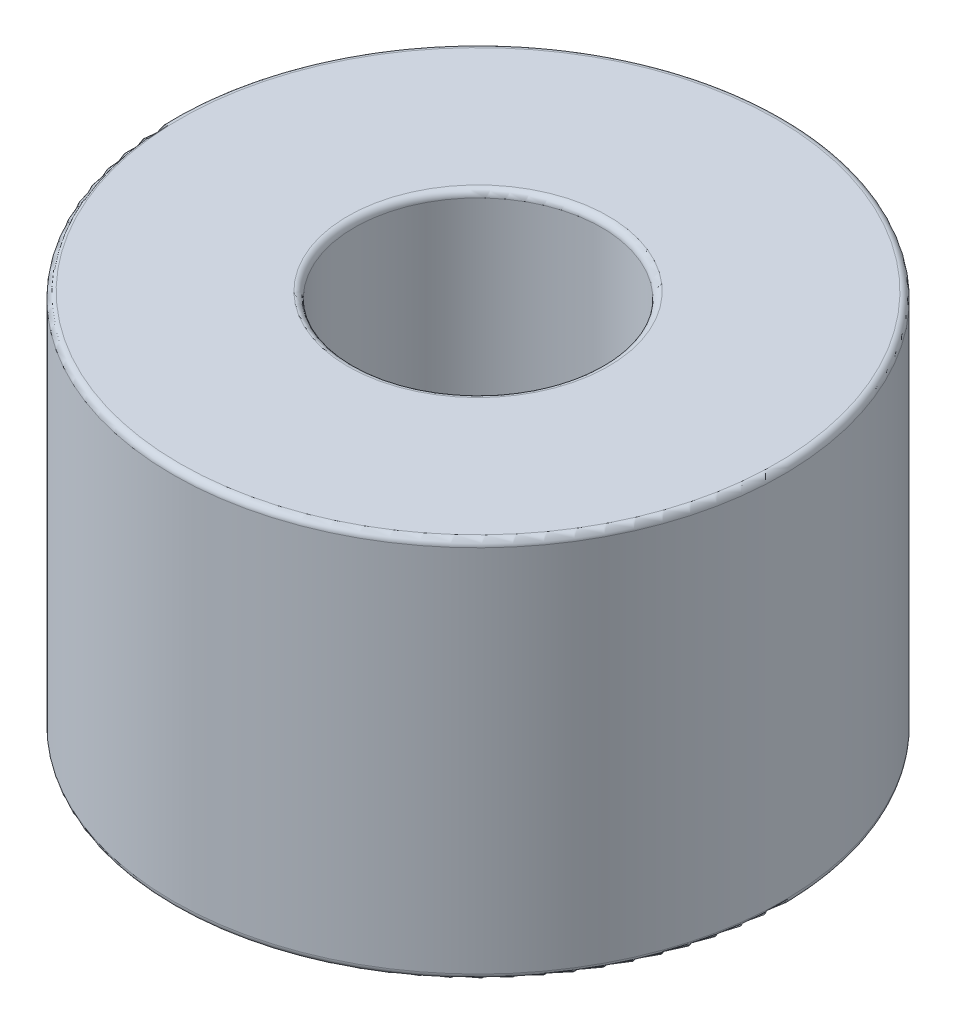
ISO-10303-21;
HEADER;
FILE_DESCRIPTION(('STEP AP214'),'2;1');
FILE_NAME('part.step','',(''),(''),'','','');
FILE_SCHEMA(('AUTOMOTIVE_DESIGN { 1 0 10303 214 1 1 1 1 }'));
ENDSEC;
DATA;
#1=APPLICATION_CONTEXT('core data for automotive mechanical design processes');
#2=APPLICATION_PROTOCOL_DEFINITION('international standard','automotive_design',2000,#1);
#3=PRODUCT_CONTEXT('',#1,'mechanical');
#4=PRODUCT('Part','Part','',(#3));
#5=PRODUCT_RELATED_PRODUCT_CATEGORY('part','',(#4));
#6=PRODUCT_DEFINITION_FORMATION('','',#4);
#7=PRODUCT_DEFINITION_CONTEXT('part definition',#1,'design');
#8=PRODUCT_DEFINITION('design','',#6,#7);
#9=PRODUCT_DEFINITION_SHAPE('','',#8);
#10=(LENGTH_UNIT() NAMED_UNIT(*) SI_UNIT(.MILLI.,.METRE.));
#11=(NAMED_UNIT(*) PLANE_ANGLE_UNIT() SI_UNIT($,.RADIAN.));
#12=(NAMED_UNIT(*) SI_UNIT($,.STERADIAN.) SOLID_ANGLE_UNIT());
#13=UNCERTAINTY_MEASURE_WITH_UNIT(LENGTH_MEASURE(1.E-05),#10,'distance_accuracy_value','');
#14=(GEOMETRIC_REPRESENTATION_CONTEXT(3) GLOBAL_UNCERTAINTY_ASSIGNED_CONTEXT((#13)) GLOBAL_UNIT_ASSIGNED_CONTEXT((#10,
#11,#12)) REPRESENTATION_CONTEXT('',''));
#15=CARTESIAN_POINT('',(0.,0.,0.));
#16=DIRECTION('',(0.,0.,1.));
#17=DIRECTION('',(1.,0.,0.));
#18=AXIS2_PLACEMENT_3D('',#15,#16,#17);
#19=CARTESIAN_POINT('',(0.,14.732,0.));
#20=DIRECTION('',(0.,1.,0.));
#21=DIRECTION('',(0.,0.,1.));
#22=AXIS2_PLACEMENT_3D('',#19,#20,#21);
#23=PLANE('',#22);
#24=CARTESIAN_POINT('',(0.,14.732,0.));
#25=DIRECTION('',(0.,1.,0.));
#26=DIRECTION('',(0.,0.,1.));
#27=AXIS2_PLACEMENT_3D('',#24,#25,#26);
#28=CIRCLE('',#27,5.019);
#29=CARTESIAN_POINT('',(0.,14.732,5.019));
#30=VERTEX_POINT('',#29);
#31=EDGE_CURVE('E52',#30,#30,#28,.F.);
#32=ORIENTED_EDGE('',*,*,#31,.T.);
#33=EDGE_LOOP('',(#32));
#34=FACE_BOUND('',#33,.T.);
#35=CARTESIAN_POINT('',(0.,14.732,0.));
#36=DIRECTION('',(0.,1.,0.));
#37=DIRECTION('',(0.,0.,1.));
#38=AXIS2_PLACEMENT_3D('',#35,#36,#37);
#39=CIRCLE('',#38,11.496);
#40=CARTESIAN_POINT('',(0.,14.732,11.496));
#41=VERTEX_POINT('',#40);
#42=EDGE_CURVE('E55',#41,#41,#39,.T.);
#43=ORIENTED_EDGE('',*,*,#42,.T.);
#44=EDGE_LOOP('',(#43));
#45=FACE_BOUND('',#44,.T.);
#46=ADVANCED_FACE('F32',(#34,#45),#23,.T.);
#47=CARTESIAN_POINT('',(0.,0.,0.));
#48=DIRECTION('',(0.,1.,0.));
#49=DIRECTION('',(0.,0.,1.));
#50=AXIS2_PLACEMENT_3D('',#47,#48,#49);
#51=PLANE('',#50);
#52=CARTESIAN_POINT('',(0.,0.,0.));
#53=DIRECTION('',(0.,1.,0.));
#54=DIRECTION('',(0.,0.,1.));
#55=AXIS2_PLACEMENT_3D('',#52,#53,#54);
#56=CIRCLE('',#55,5.019);
#57=CARTESIAN_POINT('',(0.,0.,5.019));
#58=VERTEX_POINT('',#57);
#59=EDGE_CURVE('E10',#58,#58,#56,.T.);
#60=ORIENTED_EDGE('',*,*,#59,.T.);
#61=EDGE_LOOP('',(#60));
#62=FACE_BOUND('',#61,.T.);
#63=CARTESIAN_POINT('',(0.,0.,0.));
#64=DIRECTION('',(0.,1.,0.));
#65=DIRECTION('',(0.,0.,1.));
#66=AXIS2_PLACEMENT_3D('',#63,#64,#65);
#67=CIRCLE('',#66,11.496);
#68=CARTESIAN_POINT('',(0.,0.,11.496));
#69=VERTEX_POINT('',#68);
#70=EDGE_CURVE('E39',#69,#69,#67,.F.);
#71=ORIENTED_EDGE('',*,*,#70,.T.);
#72=EDGE_LOOP('',(#71));
#73=FACE_BOUND('',#72,.T.);
#74=ADVANCED_FACE('F80',(#62,#73),#51,.F.);
#75=CARTESIAN_POINT('',(0.,14.732,0.));
#76=DIRECTION('',(0.,-1.,0.));
#77=DIRECTION('',(0.,0.,-1.));
#78=AXIS2_PLACEMENT_3D('',#75,#76,#77);
#79=CYLINDRICAL_SURFACE('',#78,11.75);
#80=CARTESIAN_POINT('',(0.,14.478,0.));
#81=DIRECTION('',(0.,1.,0.));
#82=DIRECTION('',(0.,0.,1.));
#83=AXIS2_PLACEMENT_3D('',#80,#81,#82);
#84=CIRCLE('',#83,11.75);
#85=CARTESIAN_POINT('',(0.,14.478,11.75));
#86=VERTEX_POINT('',#85);
#87=EDGE_CURVE('E43',#86,#86,#84,.F.);
#88=ORIENTED_EDGE('',*,*,#87,.T.);
#89=EDGE_LOOP('',(#88));
#90=FACE_BOUND('',#89,.T.);
#91=CARTESIAN_POINT('',(0.,0.254000000000001,0.));
#92=DIRECTION('',(0.,1.,0.));
#93=DIRECTION('',(0.,0.,1.));
#94=AXIS2_PLACEMENT_3D('',#91,#92,#93);
#95=CIRCLE('',#94,11.75);
#96=CARTESIAN_POINT('',(0.,0.254000000000001,11.75));
#97=VERTEX_POINT('',#96);
#98=EDGE_CURVE('E47',#97,#97,#95,.T.);
#99=ORIENTED_EDGE('',*,*,#98,.T.);
#100=EDGE_LOOP('',(#99));
#101=FACE_BOUND('',#100,.T.);
#102=ADVANCED_FACE('F86',(#90,#101),#79,.T.);
#103=CARTESIAN_POINT('',(0.,14.732,0.));
#104=DIRECTION('',(0.,-1.,0.));
#105=DIRECTION('',(0.,0.,-1.));
#106=AXIS2_PLACEMENT_3D('',#103,#104,#105);
#107=CYLINDRICAL_SURFACE('',#106,4.765);
#108=CARTESIAN_POINT('',(0.,14.478,0.));
#109=DIRECTION('',(0.,1.,0.));
#110=DIRECTION('',(0.,0.,1.));
#111=AXIS2_PLACEMENT_3D('',#108,#109,#110);
#112=CIRCLE('',#111,4.765);
#113=CARTESIAN_POINT('',(0.,14.478,4.765));
#114=VERTEX_POINT('',#113);
#115=EDGE_CURVE('E58',#114,#114,#112,.T.);
#116=ORIENTED_EDGE('',*,*,#115,.T.);
#117=EDGE_LOOP('',(#116));
#118=FACE_BOUND('',#117,.T.);
#119=CARTESIAN_POINT('',(0.,0.254000000000001,0.));
#120=DIRECTION('',(0.,1.,0.));
#121=DIRECTION('',(0.,0.,1.));
#122=AXIS2_PLACEMENT_3D('',#119,#120,#121);
#123=CIRCLE('',#122,4.765);
#124=CARTESIAN_POINT('',(0.,0.254000000000001,4.765));
#125=VERTEX_POINT('',#124);
#126=EDGE_CURVE('E61',#125,#125,#123,.F.);
#127=ORIENTED_EDGE('',*,*,#126,.T.);
#128=EDGE_LOOP('',(#127));
#129=FACE_BOUND('',#128,.T.);
#130=ADVANCED_FACE('F65',(#118,#129),#107,.F.);
#131=CARTESIAN_POINT('',(0.,14.478,0.));
#132=DIRECTION('',(0.,1.,0.));
#133=DIRECTION('',(0.,0.,1.));
#134=AXIS2_PLACEMENT_3D('',#131,#132,#133);
#135=TOROIDAL_SURFACE('',#134,5.019,0.254);
#136=ORIENTED_EDGE('',*,*,#31,.F.);
#137=EDGE_LOOP('',(#136));
#138=FACE_BOUND('',#137,.T.);
#139=ORIENTED_EDGE('',*,*,#115,.F.);
#140=EDGE_LOOP('',(#139));
#141=FACE_BOUND('',#140,.T.);
#142=ADVANCED_FACE('F76',(#138,#141),#135,.T.);
#143=CARTESIAN_POINT('',(0.,14.478,0.));
#144=DIRECTION('',(0.,1.,0.));
#145=DIRECTION('',(0.,0.,1.));
#146=AXIS2_PLACEMENT_3D('',#143,#144,#145);
#147=TOROIDAL_SURFACE('',#146,11.496,0.254);
#148=ORIENTED_EDGE('',*,*,#87,.F.);
#149=EDGE_LOOP('',(#148));
#150=FACE_BOUND('',#149,.T.);
#151=ORIENTED_EDGE('',*,*,#42,.F.);
#152=EDGE_LOOP('',(#151));
#153=FACE_BOUND('',#152,.T.);
#154=ADVANCED_FACE('F70',(#150,#153),#147,.T.);
#155=CARTESIAN_POINT('',(0.,0.254000000000001,0.));
#156=DIRECTION('',(0.,1.,0.));
#157=DIRECTION('',(0.,0.,1.));
#158=AXIS2_PLACEMENT_3D('',#155,#156,#157);
#159=TOROIDAL_SURFACE('',#158,5.019,0.254);
#160=ORIENTED_EDGE('',*,*,#126,.F.);
#161=EDGE_LOOP('',(#160));
#162=FACE_BOUND('',#161,.T.);
#163=ORIENTED_EDGE('',*,*,#59,.F.);
#164=EDGE_LOOP('',(#163));
#165=FACE_BOUND('',#164,.T.);
#166=ADVANCED_FACE('F67',(#162,#165),#159,.T.);
#167=CARTESIAN_POINT('',(0.,0.254000000000001,0.));
#168=DIRECTION('',(0.,1.,0.));
#169=DIRECTION('',(0.,0.,1.));
#170=AXIS2_PLACEMENT_3D('',#167,#168,#169);
#171=TOROIDAL_SURFACE('',#170,11.496,0.254);
#172=ORIENTED_EDGE('',*,*,#70,.F.);
#173=EDGE_LOOP('',(#172));
#174=FACE_BOUND('',#173,.T.);
#175=ORIENTED_EDGE('',*,*,#98,.F.);
#176=EDGE_LOOP('',(#175));
#177=FACE_BOUND('',#176,.T.);
#178=ADVANCED_FACE('F34',(#174,#177),#171,.T.);
#179=CLOSED_SHELL('',(#46,#74,#102,#130,#142,#154,#166,#178));
#180=MANIFOLD_SOLID_BREP('B2',#179);
#181=ADVANCED_BREP_SHAPE_REPRESENTATION('',(#18,#180),#14);
#182=SHAPE_DEFINITION_REPRESENTATION(#9,#181);
ENDSEC;
END-ISO-10303-21;
